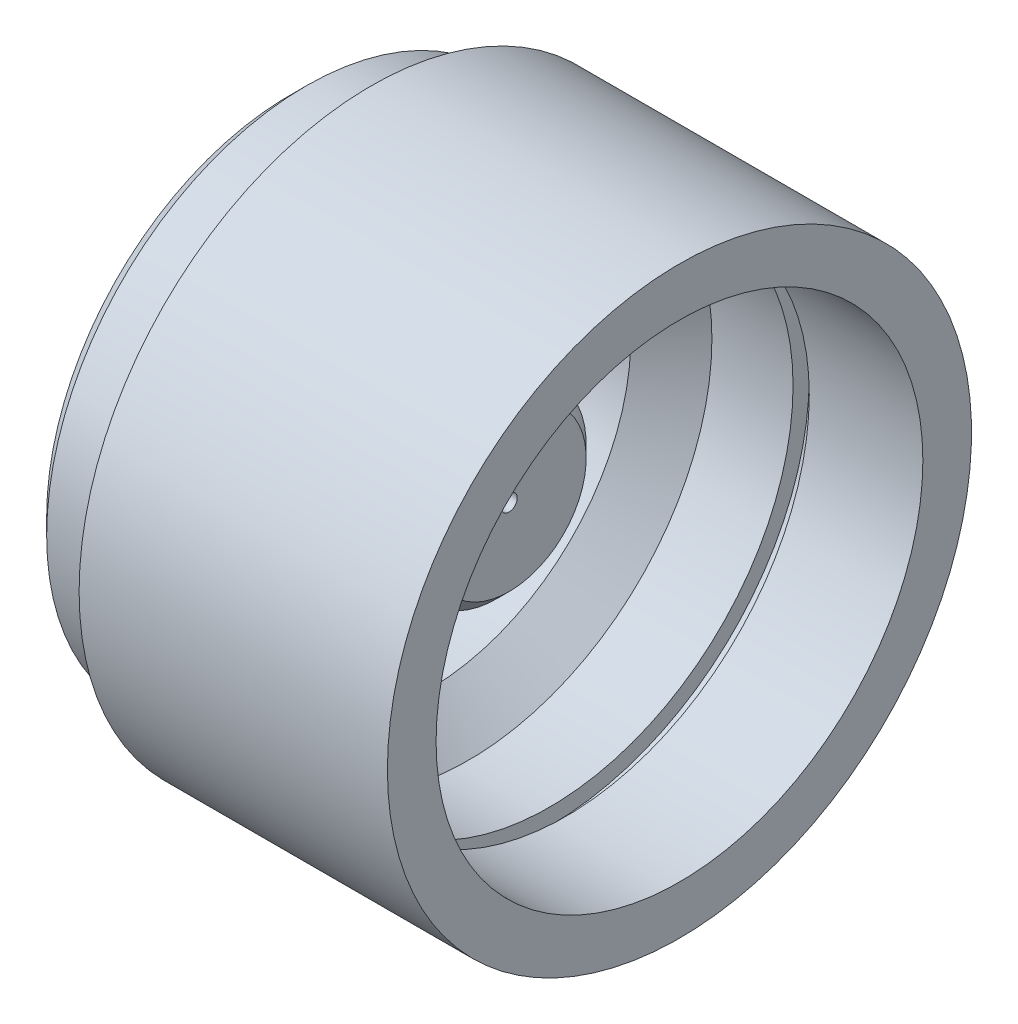
ISO-10303-21;
HEADER;
FILE_DESCRIPTION(('STEP AP214'),'2;1');
FILE_NAME('part.step','',(''),(''),'','','');
FILE_SCHEMA(('AUTOMOTIVE_DESIGN { 1 0 10303 214 1 1 1 1 }'));
ENDSEC;
DATA;
#1=APPLICATION_CONTEXT('core data for automotive mechanical design processes');
#2=APPLICATION_PROTOCOL_DEFINITION('international standard','automotive_design',2000,#1);
#3=PRODUCT_CONTEXT('',#1,'mechanical');
#4=PRODUCT('Part','Part','',(#3));
#5=PRODUCT_RELATED_PRODUCT_CATEGORY('part','',(#4));
#6=PRODUCT_DEFINITION_FORMATION('','',#4);
#7=PRODUCT_DEFINITION_CONTEXT('part definition',#1,'design');
#8=PRODUCT_DEFINITION('design','',#6,#7);
#9=PRODUCT_DEFINITION_SHAPE('','',#8);
#10=(LENGTH_UNIT() NAMED_UNIT(*) SI_UNIT(.MILLI.,.METRE.));
#11=(NAMED_UNIT(*) PLANE_ANGLE_UNIT() SI_UNIT($,.RADIAN.));
#12=(NAMED_UNIT(*) SI_UNIT($,.STERADIAN.) SOLID_ANGLE_UNIT());
#13=UNCERTAINTY_MEASURE_WITH_UNIT(LENGTH_MEASURE(1.E-05),#10,'distance_accuracy_value','');
#14=(GEOMETRIC_REPRESENTATION_CONTEXT(3) GLOBAL_UNCERTAINTY_ASSIGNED_CONTEXT((#13)) GLOBAL_UNIT_ASSIGNED_CONTEXT((#10,
#11,#12)) REPRESENTATION_CONTEXT('',''));
#15=CARTESIAN_POINT('',(0.,0.,0.));
#16=DIRECTION('',(0.,0.,1.));
#17=DIRECTION('',(1.,0.,0.));
#18=AXIS2_PLACEMENT_3D('',#15,#16,#17);
#19=CARTESIAN_POINT('',(-24.,0.,0.));
#20=DIRECTION('',(-1.,0.,0.));
#21=DIRECTION('',(0.,0.,1.));
#22=AXIS2_PLACEMENT_3D('',#19,#20,#21);
#23=CYLINDRICAL_SURFACE('',#22,15.);
#24=CARTESIAN_POINT('',(0.,0.,0.));
#25=DIRECTION('',(-1.,0.,0.));
#26=DIRECTION('',(0.,0.,1.));
#27=AXIS2_PLACEMENT_3D('',#24,#25,#26);
#28=CIRCLE('',#27,15.);
#29=CARTESIAN_POINT('',(0.,0.,15.));
#30=VERTEX_POINT('',#29);
#31=EDGE_CURVE('E121',#30,#30,#28,.T.);
#32=ORIENTED_EDGE('',*,*,#31,.F.);
#33=EDGE_LOOP('',(#32));
#34=FACE_BOUND('',#33,.T.);
#35=CARTESIAN_POINT('',(-7.,0.,0.));
#36=DIRECTION('',(-1.,0.,0.));
#37=DIRECTION('',(0.,0.,1.));
#38=AXIS2_PLACEMENT_3D('',#35,#36,#37);
#39=CIRCLE('',#38,15.);
#40=CARTESIAN_POINT('',(-7.,0.,15.));
#41=VERTEX_POINT('',#40);
#42=EDGE_CURVE('E10',#41,#41,#39,.T.);
#43=ORIENTED_EDGE('',*,*,#42,.T.);
#44=EDGE_LOOP('',(#43));
#45=FACE_BOUND('',#44,.T.);
#46=ADVANCED_FACE('F51',(#34,#45),#23,.F.);
#47=CARTESIAN_POINT('',(-7.,15.,0.));
#48=DIRECTION('',(1.,0.,0.));
#49=DIRECTION('',(0.,0.,-1.));
#50=AXIS2_PLACEMENT_3D('',#47,#48,#49);
#51=PLANE('',#50);
#52=ORIENTED_EDGE('',*,*,#42,.F.);
#53=EDGE_LOOP('',(#52));
#54=FACE_BOUND('',#53,.T.);
#55=CARTESIAN_POINT('',(-7.,0.,0.));
#56=DIRECTION('',(-1.,0.,0.));
#57=DIRECTION('',(0.,0.,1.));
#58=AXIS2_PLACEMENT_3D('',#55,#56,#57);
#59=CIRCLE('',#58,16.);
#60=CARTESIAN_POINT('',(-7.,0.,16.));
#61=VERTEX_POINT('',#60);
#62=EDGE_CURVE('E58',#61,#61,#59,.T.);
#63=ORIENTED_EDGE('',*,*,#62,.T.);
#64=EDGE_LOOP('',(#63));
#65=FACE_BOUND('',#64,.T.);
#66=ADVANCED_FACE('F199',(#54,#65),#51,.F.);
#67=CARTESIAN_POINT('',(-24.,0.,0.));
#68=DIRECTION('',(-1.,0.,0.));
#69=DIRECTION('',(0.,0.,1.));
#70=AXIS2_PLACEMENT_3D('',#67,#68,#69);
#71=CYLINDRICAL_SURFACE('',#70,16.);
#72=ORIENTED_EDGE('',*,*,#62,.F.);
#73=EDGE_LOOP('',(#72));
#74=FACE_BOUND('',#73,.T.);
#75=CARTESIAN_POINT('',(-8.,0.,0.));
#76=DIRECTION('',(-1.,0.,0.));
#77=DIRECTION('',(0.,0.,1.));
#78=AXIS2_PLACEMENT_3D('',#75,#76,#77);
#79=CIRCLE('',#78,16.);
#80=CARTESIAN_POINT('',(-8.,0.,16.));
#81=VERTEX_POINT('',#80);
#82=EDGE_CURVE('E62',#81,#81,#79,.T.);
#83=ORIENTED_EDGE('',*,*,#82,.T.);
#84=EDGE_LOOP('',(#83));
#85=FACE_BOUND('',#84,.T.);
#86=ADVANCED_FACE('F203',(#74,#85),#71,.F.);
#87=CARTESIAN_POINT('',(-8.,16.,0.));
#88=DIRECTION('',(-1.,0.,0.));
#89=DIRECTION('',(0.,0.,1.));
#90=AXIS2_PLACEMENT_3D('',#87,#88,#89);
#91=PLANE('',#90);
#92=ORIENTED_EDGE('',*,*,#82,.F.);
#93=EDGE_LOOP('',(#92));
#94=FACE_BOUND('',#93,.T.);
#95=CARTESIAN_POINT('',(-8.,0.,0.));
#96=DIRECTION('',(-1.,0.,0.));
#97=DIRECTION('',(0.,0.,1.));
#98=AXIS2_PLACEMENT_3D('',#95,#96,#97);
#99=CIRCLE('',#98,15.);
#100=CARTESIAN_POINT('',(-8.,0.,15.));
#101=VERTEX_POINT('',#100);
#102=EDGE_CURVE('E67',#101,#101,#99,.T.);
#103=ORIENTED_EDGE('',*,*,#102,.T.);
#104=EDGE_LOOP('',(#103));
#105=FACE_BOUND('',#104,.T.);
#106=ADVANCED_FACE('F209',(#94,#105),#91,.F.);
#107=CARTESIAN_POINT('',(-24.,0.,0.));
#108=DIRECTION('',(-1.,0.,0.));
#109=DIRECTION('',(0.,0.,1.));
#110=AXIS2_PLACEMENT_3D('',#107,#108,#109);
#111=CYLINDRICAL_SURFACE('',#110,15.);
#112=ORIENTED_EDGE('',*,*,#102,.F.);
#113=EDGE_LOOP('',(#112));
#114=FACE_BOUND('',#113,.T.);
#115=CARTESIAN_POINT('',(-13.,0.,0.));
#116=DIRECTION('',(-1.,0.,0.));
#117=DIRECTION('',(0.,0.,1.));
#118=AXIS2_PLACEMENT_3D('',#115,#116,#117);
#119=CIRCLE('',#118,15.);
#120=CARTESIAN_POINT('',(-13.,0.,15.));
#121=VERTEX_POINT('',#120);
#122=EDGE_CURVE('E70',#121,#121,#119,.T.);
#123=ORIENTED_EDGE('',*,*,#122,.T.);
#124=EDGE_LOOP('',(#123));
#125=FACE_BOUND('',#124,.T.);
#126=ADVANCED_FACE('F216',(#114,#125),#111,.F.);
#127=CARTESIAN_POINT('',(-15.5,0.,0.));
#128=DIRECTION('',(1.,0.,0.));
#129=DIRECTION('',(0.,0.,-1.));
#130=AXIS2_PLACEMENT_3D('',#127,#128,#129);
#131=CONICAL_SURFACE('',#130,12.5,0.78539816339745);
#132=ORIENTED_EDGE('',*,*,#122,.F.);
#133=EDGE_LOOP('',(#132));
#134=FACE_BOUND('',#133,.T.);
#135=CARTESIAN_POINT('',(-15.5,0.,0.));
#136=DIRECTION('',(-1.,0.,0.));
#137=DIRECTION('',(0.,0.,1.));
#138=AXIS2_PLACEMENT_3D('',#135,#136,#137);
#139=CIRCLE('',#138,12.5);
#140=CARTESIAN_POINT('',(-15.5,0.,12.5));
#141=VERTEX_POINT('',#140);
#142=EDGE_CURVE('E73',#141,#141,#139,.T.);
#143=ORIENTED_EDGE('',*,*,#142,.T.);
#144=EDGE_LOOP('',(#143));
#145=FACE_BOUND('',#144,.T.);
#146=ADVANCED_FACE('F220',(#134,#145),#131,.F.);
#147=CARTESIAN_POINT('',(-24.,0.,0.));
#148=DIRECTION('',(-1.,0.,0.));
#149=DIRECTION('',(0.,0.,1.));
#150=AXIS2_PLACEMENT_3D('',#147,#148,#149);
#151=CYLINDRICAL_SURFACE('',#150,12.5);
#152=ORIENTED_EDGE('',*,*,#142,.F.);
#153=EDGE_LOOP('',(#152));
#154=FACE_BOUND('',#153,.T.);
#155=CARTESIAN_POINT('',(-19.75,0.,0.));
#156=DIRECTION('',(-1.,0.,0.));
#157=DIRECTION('',(0.,0.,1.));
#158=AXIS2_PLACEMENT_3D('',#155,#156,#157);
#159=CIRCLE('',#158,12.5);
#160=CARTESIAN_POINT('',(-19.75,0.,12.5));
#161=VERTEX_POINT('',#160);
#162=EDGE_CURVE('E76',#161,#161,#159,.T.);
#163=ORIENTED_EDGE('',*,*,#162,.T.);
#164=EDGE_LOOP('',(#163));
#165=FACE_BOUND('',#164,.T.);
#166=ADVANCED_FACE('F224',(#154,#165),#151,.F.);
#167=CARTESIAN_POINT('',(-20.5,0.,0.));
#168=DIRECTION('',(1.,0.,0.));
#169=DIRECTION('',(0.,0.,-1.));
#170=AXIS2_PLACEMENT_3D('',#167,#168,#169);
#171=CONICAL_SURFACE('',#170,11.75,0.785398163397448);
#172=ORIENTED_EDGE('',*,*,#162,.F.);
#173=EDGE_LOOP('',(#172));
#174=FACE_BOUND('',#173,.T.);
#175=CARTESIAN_POINT('',(-20.5,0.,0.));
#176=DIRECTION('',(-1.,0.,0.));
#177=DIRECTION('',(0.,0.,1.));
#178=AXIS2_PLACEMENT_3D('',#175,#176,#177);
#179=CIRCLE('',#178,11.75);
#180=CARTESIAN_POINT('',(-20.5,0.,11.75));
#181=VERTEX_POINT('',#180);
#182=EDGE_CURVE('E79',#181,#181,#179,.T.);
#183=ORIENTED_EDGE('',*,*,#182,.T.);
#184=EDGE_LOOP('',(#183));
#185=FACE_BOUND('',#184,.T.);
#186=ADVANCED_FACE('F228',(#174,#185),#171,.F.);
#187=CARTESIAN_POINT('',(-20.5,6.25,0.));
#188=DIRECTION('',(-1.,0.,0.));
#189=DIRECTION('',(0.,0.,1.));
#190=AXIS2_PLACEMENT_3D('',#187,#188,#189);
#191=PLANE('',#190);
#192=ORIENTED_EDGE('',*,*,#182,.F.);
#193=EDGE_LOOP('',(#192));
#194=FACE_BOUND('',#193,.T.);
#195=CARTESIAN_POINT('',(-20.5,0.,0.));
#196=DIRECTION('',(-1.,0.,0.));
#197=DIRECTION('',(0.,0.,1.));
#198=AXIS2_PLACEMENT_3D('',#195,#196,#197);
#199=CIRCLE('',#198,6.25);
#200=CARTESIAN_POINT('',(-20.5,0.,6.25));
#201=VERTEX_POINT('',#200);
#202=EDGE_CURVE('E82',#201,#201,#199,.T.);
#203=ORIENTED_EDGE('',*,*,#202,.T.);
#204=EDGE_LOOP('',(#203));
#205=FACE_BOUND('',#204,.T.);
#206=ADVANCED_FACE('F232',(#194,#205),#191,.F.);
#207=CARTESIAN_POINT('',(-19.75,0.,0.));
#208=DIRECTION('',(-1.,0.,0.));
#209=DIRECTION('',(0.,0.,1.));
#210=AXIS2_PLACEMENT_3D('',#207,#208,#209);
#211=CONICAL_SURFACE('',#210,5.5,0.785398163397448);
#212=ORIENTED_EDGE('',*,*,#202,.F.);
#213=EDGE_LOOP('',(#212));
#214=FACE_BOUND('',#213,.T.);
#215=CARTESIAN_POINT('',(-19.75,0.,0.));
#216=DIRECTION('',(-1.,0.,0.));
#217=DIRECTION('',(0.,0.,1.));
#218=AXIS2_PLACEMENT_3D('',#215,#216,#217);
#219=CIRCLE('',#218,5.5);
#220=CARTESIAN_POINT('',(-19.75,0.,5.5));
#221=VERTEX_POINT('',#220);
#222=EDGE_CURVE('E85',#221,#221,#219,.T.);
#223=ORIENTED_EDGE('',*,*,#222,.T.);
#224=EDGE_LOOP('',(#223));
#225=FACE_BOUND('',#224,.T.);
#226=ADVANCED_FACE('F236',(#214,#225),#211,.T.);
#227=CARTESIAN_POINT('',(-24.,0.,0.));
#228=DIRECTION('',(-1.,0.,0.));
#229=DIRECTION('',(0.,0.,1.));
#230=AXIS2_PLACEMENT_3D('',#227,#228,#229);
#231=CYLINDRICAL_SURFACE('',#230,5.5);
#232=ORIENTED_EDGE('',*,*,#222,.F.);
#233=EDGE_LOOP('',(#232));
#234=FACE_BOUND('',#233,.T.);
#235=CARTESIAN_POINT('',(-11.25,0.,0.));
#236=DIRECTION('',(-1.,0.,0.));
#237=DIRECTION('',(0.,0.,1.));
#238=AXIS2_PLACEMENT_3D('',#235,#236,#237);
#239=CIRCLE('',#238,5.5);
#240=CARTESIAN_POINT('',(-11.25,0.,5.5));
#241=VERTEX_POINT('',#240);
#242=EDGE_CURVE('E88',#241,#241,#239,.T.);
#243=ORIENTED_EDGE('',*,*,#242,.T.);
#244=EDGE_LOOP('',(#243));
#245=FACE_BOUND('',#244,.T.);
#246=ADVANCED_FACE('F240',(#234,#245),#231,.T.);
#247=CARTESIAN_POINT('',(-10.5,0.,0.));
#248=DIRECTION('',(-1.,0.,0.));
#249=DIRECTION('',(0.,0.,1.));
#250=AXIS2_PLACEMENT_3D('',#247,#248,#249);
#251=CONICAL_SURFACE('',#250,4.75,0.785398163397448);
#252=ORIENTED_EDGE('',*,*,#242,.F.);
#253=EDGE_LOOP('',(#252));
#254=FACE_BOUND('',#253,.T.);
#255=CARTESIAN_POINT('',(-10.5,0.,0.));
#256=DIRECTION('',(-1.,0.,0.));
#257=DIRECTION('',(0.,0.,1.));
#258=AXIS2_PLACEMENT_3D('',#255,#256,#257);
#259=CIRCLE('',#258,4.75);
#260=CARTESIAN_POINT('',(-10.5,0.,4.75));
#261=VERTEX_POINT('',#260);
#262=EDGE_CURVE('E91',#261,#261,#259,.T.);
#263=ORIENTED_EDGE('',*,*,#262,.T.);
#264=EDGE_LOOP('',(#263));
#265=FACE_BOUND('',#264,.T.);
#266=ADVANCED_FACE('F244',(#254,#265),#251,.T.);
#267=CARTESIAN_POINT('',(-10.5,0.,0.));
#268=DIRECTION('',(-1.,0.,0.));
#269=DIRECTION('',(0.,0.,1.));
#270=AXIS2_PLACEMENT_3D('',#267,#268,#269);
#271=PLANE('',#270);
#272=CARTESIAN_POINT('',(-10.5,0.,0.));
#273=DIRECTION('',(1.,0.,0.));
#274=DIRECTION('',(0.,0.,-1.));
#275=AXIS2_PLACEMENT_3D('',#272,#273,#274);
#276=CIRCLE('',#275,0.499999999999999);
#277=CARTESIAN_POINT('',(-10.5,0.,-0.499999999999999));
#278=VERTEX_POINT('',#277);
#279=EDGE_CURVE('E124',#278,#278,#276,.T.);
#280=ORIENTED_EDGE('',*,*,#279,.F.);
#281=EDGE_LOOP('',(#280));
#282=FACE_BOUND('',#281,.T.);
#283=ORIENTED_EDGE('',*,*,#262,.F.);
#284=EDGE_LOOP('',(#283));
#285=FACE_BOUND('',#284,.T.);
#286=ADVANCED_FACE('F140',(#282,#285),#271,.F.);
#287=CARTESIAN_POINT('',(-23.,8.,0.));
#288=DIRECTION('',(1.,0.,0.));
#289=DIRECTION('',(0.,0.,-1.));
#290=AXIS2_PLACEMENT_3D('',#287,#288,#289);
#291=PLANE('',#290);
#292=CARTESIAN_POINT('',(-23.,0.,0.));
#293=DIRECTION('',(-1.,0.,0.));
#294=DIRECTION('',(0.,0.,1.));
#295=AXIS2_PLACEMENT_3D('',#292,#293,#294);
#296=CIRCLE('',#295,2.5);
#297=CARTESIAN_POINT('',(-23.,0.,2.5));
#298=VERTEX_POINT('',#297);
#299=EDGE_CURVE('E130',#298,#298,#296,.T.);
#300=ORIENTED_EDGE('',*,*,#299,.F.);
#301=EDGE_LOOP('',(#300));
#302=FACE_BOUND('',#301,.T.);
#303=CARTESIAN_POINT('',(-23.,0.,0.));
#304=DIRECTION('',(-1.,0.,0.));
#305=DIRECTION('',(0.,0.,1.));
#306=AXIS2_PLACEMENT_3D('',#303,#304,#305);
#307=CIRCLE('',#306,8.);
#308=CARTESIAN_POINT('',(-23.,0.,8.));
#309=VERTEX_POINT('',#308);
#310=EDGE_CURVE('E94',#309,#309,#307,.T.);
#311=ORIENTED_EDGE('',*,*,#310,.T.);
#312=EDGE_LOOP('',(#311));
#313=FACE_BOUND('',#312,.T.);
#314=ADVANCED_FACE('F136',(#302,#313),#291,.F.);
#315=CARTESIAN_POINT('',(-24.,0.,0.));
#316=DIRECTION('',(-1.,0.,0.));
#317=DIRECTION('',(0.,0.,1.));
#318=AXIS2_PLACEMENT_3D('',#315,#316,#317);
#319=CYLINDRICAL_SURFACE('',#318,8.);
#320=ORIENTED_EDGE('',*,*,#310,.F.);
#321=EDGE_LOOP('',(#320));
#322=FACE_BOUND('',#321,.T.);
#323=CARTESIAN_POINT('',(-24.,0.,0.));
#324=DIRECTION('',(-1.,0.,0.));
#325=DIRECTION('',(0.,0.,1.));
#326=AXIS2_PLACEMENT_3D('',#323,#324,#325);
#327=CIRCLE('',#326,8.);
#328=CARTESIAN_POINT('',(-24.,0.,8.));
#329=VERTEX_POINT('',#328);
#330=EDGE_CURVE('E97',#329,#329,#327,.T.);
#331=ORIENTED_EDGE('',*,*,#330,.T.);
#332=EDGE_LOOP('',(#331));
#333=FACE_BOUND('',#332,.T.);
#334=ADVANCED_FACE('F139',(#322,#333),#319,.F.);
#335=CARTESIAN_POINT('',(-24.,15.,0.));
#336=DIRECTION('',(1.,0.,0.));
#337=DIRECTION('',(0.,0.,-1.));
#338=AXIS2_PLACEMENT_3D('',#335,#336,#337);
#339=PLANE('',#338);
#340=ORIENTED_EDGE('',*,*,#330,.F.);
#341=EDGE_LOOP('',(#340));
#342=FACE_BOUND('',#341,.T.);
#343=CARTESIAN_POINT('',(-24.,0.,0.));
#344=DIRECTION('',(-1.,0.,0.));
#345=DIRECTION('',(0.,0.,1.));
#346=AXIS2_PLACEMENT_3D('',#343,#344,#345);
#347=CIRCLE('',#346,15.);
#348=CARTESIAN_POINT('',(-24.,0.,15.));
#349=VERTEX_POINT('',#348);
#350=EDGE_CURVE('E100',#349,#349,#347,.T.);
#351=ORIENTED_EDGE('',*,*,#350,.T.);
#352=EDGE_LOOP('',(#351));
#353=FACE_BOUND('',#352,.T.);
#354=ADVANCED_FACE('F146',(#342,#353),#339,.F.);
#355=CARTESIAN_POINT('',(-23.,0.,0.));
#356=DIRECTION('',(1.,0.,0.));
#357=DIRECTION('',(0.,0.,-1.));
#358=AXIS2_PLACEMENT_3D('',#355,#356,#357);
#359=CONICAL_SURFACE('',#358,16.,0.785398163397448);
#360=ORIENTED_EDGE('',*,*,#350,.F.);
#361=EDGE_LOOP('',(#360));
#362=FACE_BOUND('',#361,.T.);
#363=CARTESIAN_POINT('',(-23.,0.,0.));
#364=DIRECTION('',(-1.,0.,0.));
#365=DIRECTION('',(0.,0.,1.));
#366=AXIS2_PLACEMENT_3D('',#363,#364,#365);
#367=CIRCLE('',#366,16.);
#368=CARTESIAN_POINT('',(-23.,0.,16.));
#369=VERTEX_POINT('',#368);
#370=EDGE_CURVE('E103',#369,#369,#367,.T.);
#371=ORIENTED_EDGE('',*,*,#370,.T.);
#372=EDGE_LOOP('',(#371));
#373=FACE_BOUND('',#372,.T.);
#374=ADVANCED_FACE('F152',(#362,#373),#359,.T.);
#375=CARTESIAN_POINT('',(-24.,0.,0.));
#376=DIRECTION('',(-1.,0.,0.));
#377=DIRECTION('',(0.,0.,1.));
#378=AXIS2_PLACEMENT_3D('',#375,#376,#377);
#379=CYLINDRICAL_SURFACE('',#378,16.);
#380=ORIENTED_EDGE('',*,*,#370,.F.);
#381=EDGE_LOOP('',(#380));
#382=FACE_BOUND('',#381,.T.);
#383=CARTESIAN_POINT('',(-20.,0.,0.));
#384=DIRECTION('',(-1.,0.,0.));
#385=DIRECTION('',(0.,0.,1.));
#386=AXIS2_PLACEMENT_3D('',#383,#384,#385);
#387=CIRCLE('',#386,16.);
#388=CARTESIAN_POINT('',(-20.,0.,16.));
#389=VERTEX_POINT('',#388);
#390=EDGE_CURVE('E106',#389,#389,#387,.T.);
#391=ORIENTED_EDGE('',*,*,#390,.T.);
#392=EDGE_LOOP('',(#391));
#393=FACE_BOUND('',#392,.T.);
#394=ADVANCED_FACE('F158',(#382,#393),#379,.T.);
#395=CARTESIAN_POINT('',(-20.,15.,0.));
#396=DIRECTION('',(-1.,0.,0.));
#397=DIRECTION('',(0.,0.,1.));
#398=AXIS2_PLACEMENT_3D('',#395,#396,#397);
#399=PLANE('',#398);
#400=ORIENTED_EDGE('',*,*,#390,.F.);
#401=EDGE_LOOP('',(#400));
#402=FACE_BOUND('',#401,.T.);
#403=CARTESIAN_POINT('',(-20.,0.,0.));
#404=DIRECTION('',(-1.,0.,0.));
#405=DIRECTION('',(0.,0.,1.));
#406=AXIS2_PLACEMENT_3D('',#403,#404,#405);
#407=CIRCLE('',#406,15.);
#408=CARTESIAN_POINT('',(-20.,0.,15.));
#409=VERTEX_POINT('',#408);
#410=EDGE_CURVE('E109',#409,#409,#407,.T.);
#411=ORIENTED_EDGE('',*,*,#410,.T.);
#412=EDGE_LOOP('',(#411));
#413=FACE_BOUND('',#412,.T.);
#414=ADVANCED_FACE('F164',(#402,#413),#399,.F.);
#415=CARTESIAN_POINT('',(-24.,0.,0.));
#416=DIRECTION('',(-1.,0.,0.));
#417=DIRECTION('',(0.,0.,1.));
#418=AXIS2_PLACEMENT_3D('',#415,#416,#417);
#419=CYLINDRICAL_SURFACE('',#418,15.);
#420=ORIENTED_EDGE('',*,*,#410,.F.);
#421=EDGE_LOOP('',(#420));
#422=FACE_BOUND('',#421,.T.);
#423=CARTESIAN_POINT('',(-19.,0.,0.));
#424=DIRECTION('',(-1.,0.,0.));
#425=DIRECTION('',(0.,0.,1.));
#426=AXIS2_PLACEMENT_3D('',#423,#424,#425);
#427=CIRCLE('',#426,15.);
#428=CARTESIAN_POINT('',(-19.,0.,15.));
#429=VERTEX_POINT('',#428);
#430=EDGE_CURVE('E112',#429,#429,#427,.T.);
#431=ORIENTED_EDGE('',*,*,#430,.T.);
#432=EDGE_LOOP('',(#431));
#433=FACE_BOUND('',#432,.T.);
#434=ADVANCED_FACE('F170',(#422,#433),#419,.T.);
#435=CARTESIAN_POINT('',(-19.,18.,0.));
#436=DIRECTION('',(1.,0.,0.));
#437=DIRECTION('',(0.,0.,-1.));
#438=AXIS2_PLACEMENT_3D('',#435,#436,#437);
#439=PLANE('',#438);
#440=ORIENTED_EDGE('',*,*,#430,.F.);
#441=EDGE_LOOP('',(#440));
#442=FACE_BOUND('',#441,.T.);
#443=CARTESIAN_POINT('',(-19.,0.,0.));
#444=DIRECTION('',(-1.,0.,0.));
#445=DIRECTION('',(0.,0.,1.));
#446=AXIS2_PLACEMENT_3D('',#443,#444,#445);
#447=CIRCLE('',#446,18.);
#448=CARTESIAN_POINT('',(-19.,0.,18.));
#449=VERTEX_POINT('',#448);
#450=EDGE_CURVE('E115',#449,#449,#447,.T.);
#451=ORIENTED_EDGE('',*,*,#450,.T.);
#452=EDGE_LOOP('',(#451));
#453=FACE_BOUND('',#452,.T.);
#454=ADVANCED_FACE('F176',(#442,#453),#439,.F.);
#455=CARTESIAN_POINT('',(-24.,0.,0.));
#456=DIRECTION('',(-1.,0.,0.));
#457=DIRECTION('',(0.,0.,1.));
#458=AXIS2_PLACEMENT_3D('',#455,#456,#457);
#459=CYLINDRICAL_SURFACE('',#458,18.);
#460=ORIENTED_EDGE('',*,*,#450,.F.);
#461=EDGE_LOOP('',(#460));
#462=FACE_BOUND('',#461,.T.);
#463=CARTESIAN_POINT('',(0.,0.,0.));
#464=DIRECTION('',(-1.,0.,0.));
#465=DIRECTION('',(0.,0.,1.));
#466=AXIS2_PLACEMENT_3D('',#463,#464,#465);
#467=CIRCLE('',#466,18.);
#468=CARTESIAN_POINT('',(0.,0.,18.));
#469=VERTEX_POINT('',#468);
#470=EDGE_CURVE('E118',#469,#469,#467,.T.);
#471=ORIENTED_EDGE('',*,*,#470,.T.);
#472=EDGE_LOOP('',(#471));
#473=FACE_BOUND('',#472,.T.);
#474=ADVANCED_FACE('F182',(#462,#473),#459,.T.);
#475=CARTESIAN_POINT('',(0.,15.,0.));
#476=DIRECTION('',(-1.,0.,0.));
#477=DIRECTION('',(0.,0.,1.));
#478=AXIS2_PLACEMENT_3D('',#475,#476,#477);
#479=PLANE('',#478);
#480=ORIENTED_EDGE('',*,*,#470,.F.);
#481=EDGE_LOOP('',(#480));
#482=FACE_BOUND('',#481,.T.);
#483=ORIENTED_EDGE('',*,*,#31,.T.);
#484=EDGE_LOOP('',(#483));
#485=FACE_BOUND('',#484,.T.);
#486=ADVANCED_FACE('F188',(#482,#485),#479,.F.);
#487=CARTESIAN_POINT('',(-10.5,0.,0.));
#488=DIRECTION('',(1.,0.,0.));
#489=DIRECTION('',(0.,0.,-1.));
#490=AXIS2_PLACEMENT_3D('',#487,#488,#489);
#491=CYLINDRICAL_SURFACE('',#490,0.499999999999999);
#492=CARTESIAN_POINT('',(-12.2982787619449,0.,0.));
#493=DIRECTION('',(-1.,0.,0.));
#494=DIRECTION('',(0.,0.,1.));
#495=AXIS2_PLACEMENT_3D('',#492,#493,#494);
#496=CIRCLE('',#495,0.499999999999999);
#497=CARTESIAN_POINT('',(-12.2982787619449,0.,0.499999999999997));
#498=VERTEX_POINT('',#497);
#499=EDGE_CURVE('E54',#498,#498,#496,.T.);
#500=ORIENTED_EDGE('',*,*,#499,.T.);
#501=EDGE_LOOP('',(#500));
#502=FACE_BOUND('',#501,.T.);
#503=ORIENTED_EDGE('',*,*,#279,.T.);
#504=EDGE_LOOP('',(#503));
#505=FACE_BOUND('',#504,.T.);
#506=ADVANCED_FACE('F194',(#502,#505),#491,.F.);
#507=CARTESIAN_POINT('',(-13.5,0.,0.));
#508=DIRECTION('',(-1.,0.,0.));
#509=DIRECTION('',(0.,0.,1.));
#510=AXIS2_PLACEMENT_3D('',#507,#508,#509);
#511=CONICAL_SURFACE('',#510,2.5,1.02974425867665);
#512=CARTESIAN_POINT('',(-13.5,0.,0.));
#513=DIRECTION('',(-1.,0.,0.));
#514=DIRECTION('',(0.,0.,1.));
#515=AXIS2_PLACEMENT_3D('',#512,#513,#514);
#516=CIRCLE('',#515,2.5);
#517=CARTESIAN_POINT('',(-13.5,0.,2.5));
#518=VERTEX_POINT('',#517);
#519=EDGE_CURVE('E127',#518,#518,#516,.T.);
#520=CARTESIAN_POINT('',(-13.5,0.,2.5));
#521=CARTESIAN_POINT('',(-13.4874820704369,0.,2.47916666666666));
#522=CARTESIAN_POINT('',(-13.4749641408738,0.,2.45833333333333));
#523=CARTESIAN_POINT('',(-13.4499282817477,0.,2.41666666666666));
#524=CARTESIAN_POINT('',(-13.4374103521846,0.,2.39583333333333));
#525=CARTESIAN_POINT('',(-13.4123744930585,0.,2.35416666666666));
#526=CARTESIAN_POINT('',(-13.3998565634954,0.,2.33333333333333));
#527=CARTESIAN_POINT('',(-13.3748207043693,0.,2.29166666666666));
#528=CARTESIAN_POINT('',(-13.3623027748062,0.,2.27083333333333));
#529=CARTESIAN_POINT('',(-13.33726691568,0.,2.22916666666666));
#530=CARTESIAN_POINT('',(-13.324748986117,0.,2.20833333333333));
#531=CARTESIAN_POINT('',(-13.2997131269908,0.,2.16666666666666));
#532=CARTESIAN_POINT('',(-13.2871951974277,0.,2.14583333333333));
#533=CARTESIAN_POINT('',(-13.2621593383016,0.,2.10416666666666));
#534=CARTESIAN_POINT('',(-13.2496414087385,0.,2.08333333333333));
#535=CARTESIAN_POINT('',(-13.2246055496124,0.,2.04166666666666));
#536=CARTESIAN_POINT('',(-13.2120876200493,0.,2.02083333333333));
#537=CARTESIAN_POINT('',(-13.1870517609231,0.,1.97916666666666));
#538=CARTESIAN_POINT('',(-13.1745338313601,0.,1.95833333333333));
#539=CARTESIAN_POINT('',(-13.1494979722339,0.,1.91666666666666));
#540=CARTESIAN_POINT('',(-13.1369800426708,0.,1.89583333333333));
#541=CARTESIAN_POINT('',(-13.1119441835447,0.,1.85416666666666));
#542=CARTESIAN_POINT('',(-13.0994262539816,0.,1.83333333333333));
#543=CARTESIAN_POINT('',(-13.0743903948555,0.,1.79166666666666));
#544=CARTESIAN_POINT('',(-13.0618724652924,0.,1.77083333333333));
#545=CARTESIAN_POINT('',(-13.0368366061663,0.,1.72916666666666));
#546=CARTESIAN_POINT('',(-13.0243186766032,0.,1.70833333333333));
#547=CARTESIAN_POINT('',(-12.999282817477,0.,1.66666666666666));
#548=CARTESIAN_POINT('',(-12.986764887914,0.,1.64583333333333));
#549=CARTESIAN_POINT('',(-12.9617290287878,0.,1.60416666666666));
#550=CARTESIAN_POINT('',(-12.9492110992247,0.,1.58333333333333));
#551=CARTESIAN_POINT('',(-12.9241752400986,0.,1.54166666666666));
#552=CARTESIAN_POINT('',(-12.9116573105355,0.,1.52083333333333));
#553=CARTESIAN_POINT('',(-12.8866214514094,0.,1.47916666666666));
#554=CARTESIAN_POINT('',(-12.8741035218463,0.,1.45833333333333));
#555=CARTESIAN_POINT('',(-12.8490676627201,0.,1.41666666666666));
#556=CARTESIAN_POINT('',(-12.8365497331571,0.,1.39583333333333));
#557=CARTESIAN_POINT('',(-12.8115138740309,0.,1.35416666666666));
#558=CARTESIAN_POINT('',(-12.7989959444678,0.,1.33333333333333));
#559=CARTESIAN_POINT('',(-12.7739600853417,0.,1.29166666666666));
#560=CARTESIAN_POINT('',(-12.7614421557786,0.,1.27083333333333));
#561=CARTESIAN_POINT('',(-12.7364062966525,0.,1.22916666666666));
#562=CARTESIAN_POINT('',(-12.7238883670894,0.,1.20833333333333));
#563=CARTESIAN_POINT('',(-12.6988525079632,0.,1.16666666666666));
#564=CARTESIAN_POINT('',(-12.6863345784002,0.,1.14583333333333));
#565=CARTESIAN_POINT('',(-12.661298719274,0.,1.10416666666666));
#566=CARTESIAN_POINT('',(-12.648780789711,0.,1.08333333333333));
#567=CARTESIAN_POINT('',(-12.6237449305848,0.,1.04166666666666));
#568=CARTESIAN_POINT('',(-12.6112270010217,0.,1.02083333333333));
#569=CARTESIAN_POINT('',(-12.5861911418956,0.,0.979166666666663));
#570=CARTESIAN_POINT('',(-12.5736732123325,0.,0.95833333333333));
#571=CARTESIAN_POINT('',(-12.5486373532064,0.,0.916666666666663));
#572=CARTESIAN_POINT('',(-12.5361194236433,0.,0.89583333333333));
#573=CARTESIAN_POINT('',(-12.5110835645171,0.,0.854166666666663));
#574=CARTESIAN_POINT('',(-12.4985656349541,0.,0.83333333333333));
#575=CARTESIAN_POINT('',(-12.4735297758279,0.,0.791666666666663));
#576=CARTESIAN_POINT('',(-12.4610118462648,0.,0.77083333333333));
#577=CARTESIAN_POINT('',(-12.4359759871387,0.,0.729166666666663));
#578=CARTESIAN_POINT('',(-12.4234580575756,0.,0.70833333333333));
#579=CARTESIAN_POINT('',(-12.3984221984495,0.,0.666666666666664));
#580=CARTESIAN_POINT('',(-12.3859042688864,0.,0.64583333333333));
#581=CARTESIAN_POINT('',(-12.3608684097602,0.,0.604166666666663));
#582=CARTESIAN_POINT('',(-12.3483504801972,0.,0.58333333333333));
#583=CARTESIAN_POINT('',(-12.323314621071,0.,0.541666666666663));
#584=CARTESIAN_POINT('',(-12.310796691508,0.,0.52083333333333));
#585=CARTESIAN_POINT('',(-12.2982787619449,0.,0.499999999999997));
#586=B_SPLINE_CURVE_WITH_KNOTS('',3,(#520,#521,#522,#523,#524,#525,#526,#527,#528,#529,#530,
#531,#532,#533,#534,#535,#536,#537,#538,#539,#540,#541,#542,#543,#544,#545,#546,#547,#548,#549,
#550,#551,#552,#553,#554,#555,#556,#557,#558,#559,#560,#561,#562,#563,#564,#565,#566,#567,#568,
#569,#570,#571,#572,#573,#574,#575,#576,#577,#578,#579,#580,#581,#582,#583,#584,#585),
.UNSPECIFIED.,.F.,.F.,(4,2,2,2,2,2,2,2,2,2,2,2,2,2,2,2,2,2,2,2,2,2,2,2,2,2,2,2,2,2,2,2,4),(0.,
0.0729145873259582,0.145829174651916,0.218743761977875,0.291658349303833,0.364572936629791,
0.437487523955749,0.510402111281707,0.583316698607666,0.656231285933623,0.729145873259582,
0.80206046058554,0.874975047911498,0.947889635237456,1.02080422256341,1.09371880988937,
1.16663339721533,1.23954798454129,1.31246257186725,1.38537715919321,1.45829174651916,
1.53120633384512,1.60412092117108,1.67703550849704,1.749950095823,1.82286468314895,
1.89577927047491,1.96869385780087,2.04160844512683,2.11452303245279,2.18743761977875,
2.2603522071047,2.33326679443066),.UNSPECIFIED.);
#587=EDGE_CURVE('BSEAM254',#518,#498,#586,.T.);
#588=ORIENTED_EDGE('',*,*,#519,.T.);
#589=ORIENTED_EDGE('',*,*,#499,.F.);
#590=ORIENTED_EDGE('',*,*,#587,.T.);
#591=ORIENTED_EDGE('',*,*,#587,.F.);
#592=EDGE_LOOP('',(#588,#590,#589,#591));
#593=FACE_BOUND('',#592,.T.);
#594=ADVANCED_FACE('F254',(#593),#511,.F.);
#595=CARTESIAN_POINT('',(-23.,0.,0.));
#596=DIRECTION('',(-1.,0.,0.));
#597=DIRECTION('',(0.,0.,1.));
#598=AXIS2_PLACEMENT_3D('',#595,#596,#597);
#599=CYLINDRICAL_SURFACE('',#598,2.5);
#600=ORIENTED_EDGE('',*,*,#519,.F.);
#601=EDGE_LOOP('',(#600));
#602=FACE_BOUND('',#601,.T.);
#603=ORIENTED_EDGE('',*,*,#299,.T.);
#604=EDGE_LOOP('',(#603));
#605=FACE_BOUND('',#604,.T.);
#606=ADVANCED_FACE('F134',(#602,#605),#599,.F.);
#607=CLOSED_SHELL('',(#46,#66,#86,#106,#126,#146,#166,#186,#206,#226,#246,#266,#286,#314,#334,
#354,#374,#394,#414,#434,#454,#474,#486,#506,#594,#606));
#608=MANIFOLD_SOLID_BREP('B2',#607);
#609=ADVANCED_BREP_SHAPE_REPRESENTATION('',(#18,#608),#14);
#610=SHAPE_DEFINITION_REPRESENTATION(#9,#609);
ENDSEC;
END-ISO-10303-21;
